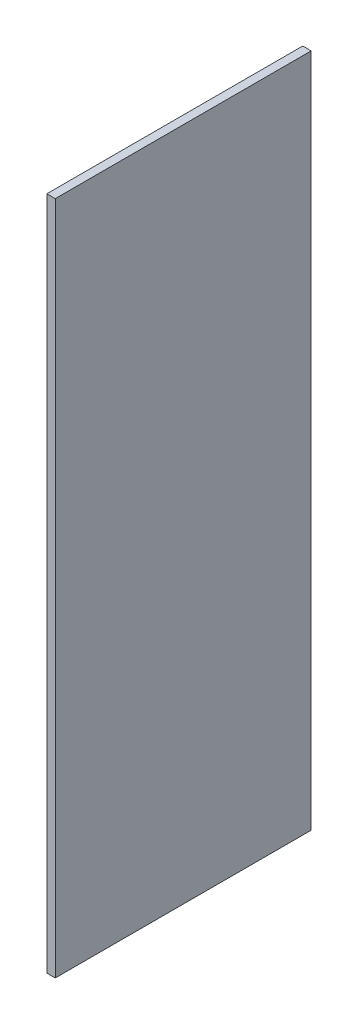
ISO-10303-21;
HEADER;
FILE_DESCRIPTION(('STEP AP214'),'2;1');
FILE_NAME('part.step','',(''),(''),'','','');
FILE_SCHEMA(('AUTOMOTIVE_DESIGN { 1 0 10303 214 1 1 1 1 }'));
ENDSEC;
DATA;
#1=APPLICATION_CONTEXT('core data for automotive mechanical design processes');
#2=APPLICATION_PROTOCOL_DEFINITION('international standard','automotive_design',2000,#1);
#3=PRODUCT_CONTEXT('',#1,'mechanical');
#4=PRODUCT('Part','Part','',(#3));
#5=PRODUCT_RELATED_PRODUCT_CATEGORY('part','',(#4));
#6=PRODUCT_DEFINITION_FORMATION('','',#4);
#7=PRODUCT_DEFINITION_CONTEXT('part definition',#1,'design');
#8=PRODUCT_DEFINITION('design','',#6,#7);
#9=PRODUCT_DEFINITION_SHAPE('','',#8);
#10=(LENGTH_UNIT() NAMED_UNIT(*) SI_UNIT(.MILLI.,.METRE.));
#11=(NAMED_UNIT(*) PLANE_ANGLE_UNIT() SI_UNIT($,.RADIAN.));
#12=(NAMED_UNIT(*) SI_UNIT($,.STERADIAN.) SOLID_ANGLE_UNIT());
#13=UNCERTAINTY_MEASURE_WITH_UNIT(LENGTH_MEASURE(1.E-05),#10,'distance_accuracy_value','');
#14=(GEOMETRIC_REPRESENTATION_CONTEXT(3) GLOBAL_UNCERTAINTY_ASSIGNED_CONTEXT((#13)) GLOBAL_UNIT_ASSIGNED_CONTEXT((#10,
#11,#12)) REPRESENTATION_CONTEXT('',''));
#15=CARTESIAN_POINT('',(0.,0.,0.));
#16=DIRECTION('',(0.,0.,1.));
#17=DIRECTION('',(1.,0.,0.));
#18=AXIS2_PLACEMENT_3D('',#15,#16,#17);
#19=CARTESIAN_POINT('',(75.,3000.,-1137.5));
#20=DIRECTION('',(0.,0.,1.));
#21=DIRECTION('',(0.,-1.,0.));
#22=AXIS2_PLACEMENT_3D('',#19,#20,#21);
#23=PLANE('',#22);
#24=DIRECTION('',(0.,1.,0.));
#25=VECTOR('',#24,1.);
#26=CARTESIAN_POINT('',(0.,3000.,-1137.5));
#27=LINE('',#26,#25);
#28=CARTESIAN_POINT('',(0.,-3000.,-1137.5));
#29=VERTEX_POINT('',#28);
#30=CARTESIAN_POINT('',(0.,3000.,-1137.5));
#31=VERTEX_POINT('',#30);
#32=EDGE_CURVE('E115',#29,#31,#27,.T.);
#33=ORIENTED_EDGE('',*,*,#32,.T.);
#34=DIRECTION('',(-1.,0.,0.));
#35=VECTOR('',#34,1.);
#36=CARTESIAN_POINT('',(75.,3000.,-1137.5));
#37=LINE('',#36,#35);
#38=CARTESIAN_POINT('',(75.,3000.,-1137.5));
#39=VERTEX_POINT('',#38);
#40=EDGE_CURVE('E11',#39,#31,#37,.T.);
#41=ORIENTED_EDGE('',*,*,#40,.F.);
#42=DIRECTION('',(0.,1.,0.));
#43=VECTOR('',#42,1.);
#44=CARTESIAN_POINT('',(75.,3000.,-1137.5));
#45=LINE('',#44,#43);
#46=CARTESIAN_POINT('',(75.,-3000.,-1137.5));
#47=VERTEX_POINT('',#46);
#48=EDGE_CURVE('E99',#47,#39,#45,.T.);
#49=ORIENTED_EDGE('',*,*,#48,.F.);
#50=DIRECTION('',(-1.,0.,0.));
#51=VECTOR('',#50,1.);
#52=CARTESIAN_POINT('',(75.,-3000.,-1137.5));
#53=LINE('',#52,#51);
#54=EDGE_CURVE('E111',#47,#29,#53,.T.);
#55=ORIENTED_EDGE('',*,*,#54,.T.);
#56=EDGE_LOOP('',(#33,#41,#49,#55));
#57=FACE_BOUND('',#56,.T.);
#58=ADVANCED_FACE('F47',(#57),#23,.F.);
#59=CARTESIAN_POINT('',(75.,3000.,1137.5));
#60=DIRECTION('',(0.,-1.,0.));
#61=DIRECTION('',(0.,0.,-1.));
#62=AXIS2_PLACEMENT_3D('',#59,#60,#61);
#63=PLANE('',#62);
#64=DIRECTION('',(0.,0.,1.));
#65=VECTOR('',#64,1.);
#66=CARTESIAN_POINT('',(0.,3000.,1137.5));
#67=LINE('',#66,#65);
#68=CARTESIAN_POINT('',(0.,3000.,1137.5));
#69=VERTEX_POINT('',#68);
#70=EDGE_CURVE('E104',#31,#69,#67,.T.);
#71=ORIENTED_EDGE('',*,*,#70,.T.);
#72=DIRECTION('',(-1.,0.,0.));
#73=VECTOR('',#72,1.);
#74=CARTESIAN_POINT('',(75.,3000.,1137.5));
#75=LINE('',#74,#73);
#76=CARTESIAN_POINT('',(75.,3000.,1137.5));
#77=VERTEX_POINT('',#76);
#78=EDGE_CURVE('E56',#77,#69,#75,.T.);
#79=ORIENTED_EDGE('',*,*,#78,.F.);
#80=DIRECTION('',(0.,0.,1.));
#81=VECTOR('',#80,1.);
#82=CARTESIAN_POINT('',(75.,3000.,1137.5));
#83=LINE('',#82,#81);
#84=EDGE_CURVE('E94',#39,#77,#83,.T.);
#85=ORIENTED_EDGE('',*,*,#84,.F.);
#86=ORIENTED_EDGE('',*,*,#40,.T.);
#87=EDGE_LOOP('',(#71,#79,#85,#86));
#88=FACE_BOUND('',#87,.T.);
#89=ADVANCED_FACE('F103',(#88),#63,.F.);
#90=CARTESIAN_POINT('',(75.,3000.,1137.5));
#91=DIRECTION('',(0.,0.,-1.));
#92=DIRECTION('',(0.,1.,0.));
#93=AXIS2_PLACEMENT_3D('',#90,#91,#92);
#94=PLANE('',#93);
#95=DIRECTION('',(0.,-1.,0.));
#96=VECTOR('',#95,1.);
#97=CARTESIAN_POINT('',(0.,3000.,1137.5));
#98=LINE('',#97,#96);
#99=CARTESIAN_POINT('',(0.,-3000.,1137.5));
#100=VERTEX_POINT('',#99);
#101=EDGE_CURVE('E81',#69,#100,#98,.T.);
#102=ORIENTED_EDGE('',*,*,#101,.T.);
#103=DIRECTION('',(-1.,0.,0.));
#104=VECTOR('',#103,1.);
#105=CARTESIAN_POINT('',(75.,-3000.,1137.5));
#106=LINE('',#105,#104);
#107=CARTESIAN_POINT('',(75.,-3000.,1137.5));
#108=VERTEX_POINT('',#107);
#109=EDGE_CURVE('E106',#108,#100,#106,.T.);
#110=ORIENTED_EDGE('',*,*,#109,.F.);
#111=DIRECTION('',(0.,-1.,0.));
#112=VECTOR('',#111,1.);
#113=CARTESIAN_POINT('',(75.,3000.,1137.5));
#114=LINE('',#113,#112);
#115=EDGE_CURVE('E97',#77,#108,#114,.T.);
#116=ORIENTED_EDGE('',*,*,#115,.F.);
#117=ORIENTED_EDGE('',*,*,#78,.T.);
#118=EDGE_LOOP('',(#102,#110,#116,#117));
#119=FACE_BOUND('',#118,.T.);
#120=ADVANCED_FACE('F107',(#119),#94,.F.);
#121=CARTESIAN_POINT('',(75.,-3000.,1137.5));
#122=DIRECTION('',(0.,1.,0.));
#123=DIRECTION('',(0.,0.,1.));
#124=AXIS2_PLACEMENT_3D('',#121,#122,#123);
#125=PLANE('',#124);
#126=DIRECTION('',(0.,0.,-1.));
#127=VECTOR('',#126,1.);
#128=CARTESIAN_POINT('',(0.,-3000.,1137.5));
#129=LINE('',#128,#127);
#130=EDGE_CURVE('E87',#100,#29,#129,.T.);
#131=ORIENTED_EDGE('',*,*,#130,.T.);
#132=ORIENTED_EDGE('',*,*,#54,.F.);
#133=DIRECTION('',(0.,0.,-1.));
#134=VECTOR('',#133,1.);
#135=CARTESIAN_POINT('',(75.,-3000.,1137.5));
#136=LINE('',#135,#134);
#137=EDGE_CURVE('E64',#108,#47,#136,.T.);
#138=ORIENTED_EDGE('',*,*,#137,.F.);
#139=ORIENTED_EDGE('',*,*,#109,.T.);
#140=EDGE_LOOP('',(#131,#132,#138,#139));
#141=FACE_BOUND('',#140,.T.);
#142=ADVANCED_FACE('F128',(#141),#125,.F.);
#143=CARTESIAN_POINT('',(75.,0.,0.));
#144=DIRECTION('',(1.,0.,0.));
#145=DIRECTION('',(0.,0.,-1.));
#146=AXIS2_PLACEMENT_3D('',#143,#144,#145);
#147=PLANE('',#146);
#148=ORIENTED_EDGE('',*,*,#48,.T.);
#149=ORIENTED_EDGE('',*,*,#84,.T.);
#150=ORIENTED_EDGE('',*,*,#115,.T.);
#151=ORIENTED_EDGE('',*,*,#137,.T.);
#152=EDGE_LOOP('',(#148,#149,#150,#151));
#153=FACE_BOUND('',#152,.T.);
#154=ADVANCED_FACE('F95',(#153),#147,.T.);
#155=CARTESIAN_POINT('',(0.,0.,0.));
#156=DIRECTION('',(1.,0.,0.));
#157=DIRECTION('',(0.,0.,-1.));
#158=AXIS2_PLACEMENT_3D('',#155,#156,#157);
#159=PLANE('',#158);
#160=ORIENTED_EDGE('',*,*,#32,.F.);
#161=ORIENTED_EDGE('',*,*,#130,.F.);
#162=ORIENTED_EDGE('',*,*,#101,.F.);
#163=ORIENTED_EDGE('',*,*,#70,.F.);
#164=EDGE_LOOP('',(#160,#161,#162,#163));
#165=FACE_BOUND('',#164,.T.);
#166=ADVANCED_FACE('F131',(#165),#159,.F.);
#167=CLOSED_SHELL('',(#58,#89,#120,#142,#154,#166));
#168=MANIFOLD_SOLID_BREP('B2',#167);
#169=ADVANCED_BREP_SHAPE_REPRESENTATION('',(#18,#168),#14);
#170=SHAPE_DEFINITION_REPRESENTATION(#9,#169);
ENDSEC;
END-ISO-10303-21;
